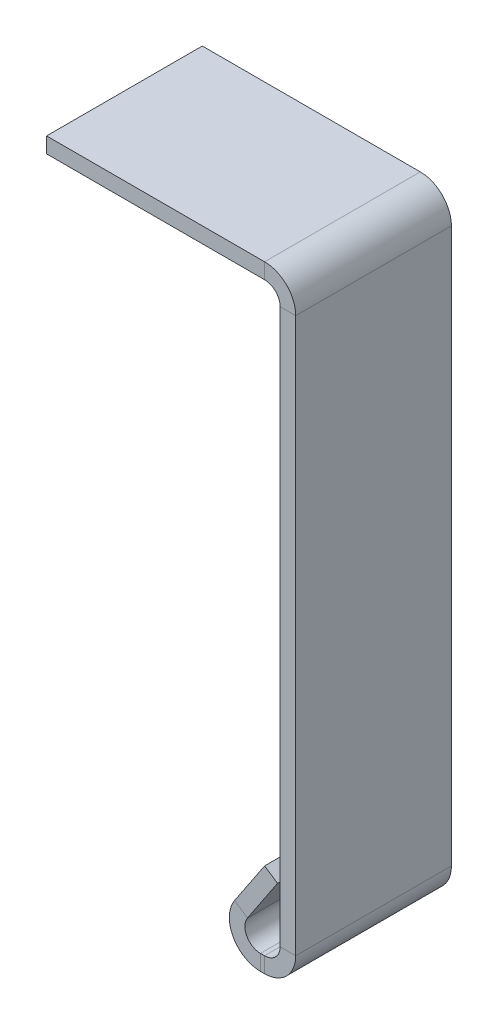
ISO-10303-21;
HEADER;
FILE_DESCRIPTION(('STEP AP214'),'2;1');
FILE_NAME('part.step','',(''),(''),'','','');
FILE_SCHEMA(('AUTOMOTIVE_DESIGN { 1 0 10303 214 1 1 1 1 }'));
ENDSEC;
DATA;
#1=APPLICATION_CONTEXT('core data for automotive mechanical design processes');
#2=APPLICATION_PROTOCOL_DEFINITION('international standard','automotive_design',2000,#1);
#3=PRODUCT_CONTEXT('',#1,'mechanical');
#4=PRODUCT('Part','Part','',(#3));
#5=PRODUCT_RELATED_PRODUCT_CATEGORY('part','',(#4));
#6=PRODUCT_DEFINITION_FORMATION('','',#4);
#7=PRODUCT_DEFINITION_CONTEXT('part definition',#1,'design');
#8=PRODUCT_DEFINITION('design','',#6,#7);
#9=PRODUCT_DEFINITION_SHAPE('','',#8);
#10=(LENGTH_UNIT() NAMED_UNIT(*) SI_UNIT(.MILLI.,.METRE.));
#11=(NAMED_UNIT(*) PLANE_ANGLE_UNIT() SI_UNIT($,.RADIAN.));
#12=(NAMED_UNIT(*) SI_UNIT($,.STERADIAN.) SOLID_ANGLE_UNIT());
#13=UNCERTAINTY_MEASURE_WITH_UNIT(LENGTH_MEASURE(1.E-05),#10,'distance_accuracy_value','');
#14=(GEOMETRIC_REPRESENTATION_CONTEXT(3) GLOBAL_UNCERTAINTY_ASSIGNED_CONTEXT((#13)) GLOBAL_UNIT_ASSIGNED_CONTEXT((#10,
#11,#12)) REPRESENTATION_CONTEXT('',''));
#15=CARTESIAN_POINT('',(0.,0.,0.));
#16=DIRECTION('',(0.,0.,1.));
#17=DIRECTION('',(1.,0.,0.));
#18=AXIS2_PLACEMENT_3D('',#15,#16,#17);
#19=CARTESIAN_POINT('',(0.,18.8,2.5));
#20=DIRECTION('',(0.,0.,1.));
#21=DIRECTION('',(1.,0.,0.));
#22=AXIS2_PLACEMENT_3D('',#19,#20,#21);
#23=PLANE('',#22);
#24=DIRECTION('',(-1.,0.,0.));
#25=VECTOR('',#24,1.);
#26=CARTESIAN_POINT('',(0.,18.8,2.5));
#27=LINE('',#26,#25);
#28=CARTESIAN_POINT('',(0.,18.8,2.5));
#29=VERTEX_POINT('',#28);
#30=CARTESIAN_POINT('',(-0.5,18.8,2.5));
#31=VERTEX_POINT('',#30);
#32=EDGE_CURVE('E11',#29,#31,#27,.T.);
#33=ORIENTED_EDGE('',*,*,#32,.F.);
#34=CARTESIAN_POINT('',(-1.,18.8,2.5));
#35=DIRECTION('',(0.,0.,1.));
#36=DIRECTION('',(1.,0.,0.));
#37=AXIS2_PLACEMENT_3D('',#34,#35,#36);
#38=CIRCLE('',#37,1.);
#39=CARTESIAN_POINT('',(-1.,19.8,2.5));
#40=VERTEX_POINT('',#39);
#41=EDGE_CURVE('E310',#40,#29,#38,.F.);
#42=ORIENTED_EDGE('',*,*,#41,.F.);
#43=DIRECTION('',(0.,1.,0.));
#44=VECTOR('',#43,1.);
#45=CARTESIAN_POINT('',(-1.,19.3,2.5));
#46=LINE('',#45,#44);
#47=CARTESIAN_POINT('',(-1.,19.3,2.5));
#48=VERTEX_POINT('',#47);
#49=EDGE_CURVE('E45',#48,#40,#46,.T.);
#50=ORIENTED_EDGE('',*,*,#49,.F.);
#51=CARTESIAN_POINT('',(-1.,18.8,2.5));
#52=DIRECTION('',(0.,0.,1.));
#53=DIRECTION('',(1.,0.,0.));
#54=AXIS2_PLACEMENT_3D('',#51,#52,#53);
#55=CIRCLE('',#54,0.5);
#56=EDGE_CURVE('E323',#48,#31,#55,.F.);
#57=ORIENTED_EDGE('',*,*,#56,.T.);
#58=EDGE_LOOP('',(#33,#42,#50,#57));
#59=FACE_BOUND('',#58,.T.);
#60=ADVANCED_FACE('F37',(#59),#23,.T.);
#61=CARTESIAN_POINT('',(-1.,19.3,2.5));
#62=DIRECTION('',(0.,0.,1.));
#63=DIRECTION('',(1.,0.,0.));
#64=AXIS2_PLACEMENT_3D('',#61,#62,#63);
#65=PLANE('',#64);
#66=DIRECTION('',(0.,-1.,0.));
#67=VECTOR('',#66,1.);
#68=CARTESIAN_POINT('',(0.,19.8,2.5));
#69=LINE('',#68,#67);
#70=CARTESIAN_POINT('',(0.,1.00000000000002,2.5));
#71=VERTEX_POINT('',#70);
#72=EDGE_CURVE('E314',#29,#71,#69,.T.);
#73=ORIENTED_EDGE('',*,*,#72,.F.);
#74=ORIENTED_EDGE('',*,*,#32,.T.);
#75=DIRECTION('',(0.,-1.,0.));
#76=VECTOR('',#75,1.);
#77=CARTESIAN_POINT('',(-0.5,19.8,2.5));
#78=LINE('',#77,#76);
#79=CARTESIAN_POINT('',(-0.5,1.00000000000001,2.5));
#80=VERTEX_POINT('',#79);
#81=EDGE_CURVE('E180',#31,#80,#78,.T.);
#82=ORIENTED_EDGE('',*,*,#81,.T.);
#83=DIRECTION('',(1.,0.,0.));
#84=VECTOR('',#83,1.);
#85=CARTESIAN_POINT('',(-0.5,1.00000000000001,2.5));
#86=LINE('',#85,#84);
#87=EDGE_CURVE('E171',#80,#71,#86,.T.);
#88=ORIENTED_EDGE('',*,*,#87,.T.);
#89=EDGE_LOOP('',(#73,#74,#82,#88));
#90=FACE_BOUND('',#89,.T.);
#91=ADVANCED_FACE('F328',(#90),#65,.T.);
#92=CARTESIAN_POINT('',(-1.,19.8,-2.5));
#93=DIRECTION('',(0.,0.,-1.));
#94=DIRECTION('',(-1.,0.,0.));
#95=AXIS2_PLACEMENT_3D('',#92,#93,#94);
#96=PLANE('',#95);
#97=DIRECTION('',(0.,-1.,0.));
#98=VECTOR('',#97,1.);
#99=CARTESIAN_POINT('',(-1.,19.8,-2.5));
#100=LINE('',#99,#98);
#101=CARTESIAN_POINT('',(-1.,19.8,-2.5));
#102=VERTEX_POINT('',#101);
#103=CARTESIAN_POINT('',(-1.,19.3,-2.5));
#104=VERTEX_POINT('',#103);
#105=EDGE_CURVE('E290',#102,#104,#100,.T.);
#106=ORIENTED_EDGE('',*,*,#105,.F.);
#107=CARTESIAN_POINT('',(-1.,18.8,-2.5));
#108=DIRECTION('',(0.,0.,1.));
#109=DIRECTION('',(1.,0.,0.));
#110=AXIS2_PLACEMENT_3D('',#107,#108,#109);
#111=CIRCLE('',#110,1.);
#112=CARTESIAN_POINT('',(0.,18.8,-2.5));
#113=VERTEX_POINT('',#112);
#114=EDGE_CURVE('E220',#102,#113,#111,.F.);
#115=ORIENTED_EDGE('',*,*,#114,.T.);
#116=DIRECTION('',(1.,0.,0.));
#117=VECTOR('',#116,1.);
#118=CARTESIAN_POINT('',(-0.5,18.8,-2.5));
#119=LINE('',#118,#117);
#120=CARTESIAN_POINT('',(-0.5,18.8,-2.5));
#121=VERTEX_POINT('',#120);
#122=EDGE_CURVE('E170',#121,#113,#119,.T.);
#123=ORIENTED_EDGE('',*,*,#122,.F.);
#124=CARTESIAN_POINT('',(-1.,18.8,-2.5));
#125=DIRECTION('',(0.,0.,1.));
#126=DIRECTION('',(1.,0.,0.));
#127=AXIS2_PLACEMENT_3D('',#124,#125,#126);
#128=CIRCLE('',#127,0.5);
#129=EDGE_CURVE('E232',#104,#121,#128,.F.);
#130=ORIENTED_EDGE('',*,*,#129,.F.);
#131=EDGE_LOOP('',(#106,#115,#123,#130));
#132=FACE_BOUND('',#131,.T.);
#133=ADVANCED_FACE('F380',(#132),#96,.T.);
#134=CARTESIAN_POINT('',(-0.5,18.8,-2.5));
#135=DIRECTION('',(0.,0.,-1.));
#136=DIRECTION('',(-1.,0.,0.));
#137=AXIS2_PLACEMENT_3D('',#134,#135,#136);
#138=PLANE('',#137);
#139=DIRECTION('',(1.,0.,0.));
#140=VECTOR('',#139,1.);
#141=CARTESIAN_POINT('',(-8.,19.8,-2.5));
#142=LINE('',#141,#140);
#143=CARTESIAN_POINT('',(-8.,19.8,-2.5));
#144=VERTEX_POINT('',#143);
#145=EDGE_CURVE('E223',#144,#102,#142,.T.);
#146=ORIENTED_EDGE('',*,*,#145,.T.);
#147=ORIENTED_EDGE('',*,*,#105,.T.);
#148=DIRECTION('',(1.,0.,0.));
#149=VECTOR('',#148,1.);
#150=CARTESIAN_POINT('',(-8.,19.3,-2.5));
#151=LINE('',#150,#149);
#152=CARTESIAN_POINT('',(-8.,19.3,-2.5));
#153=VERTEX_POINT('',#152);
#154=EDGE_CURVE('E229',#153,#104,#151,.T.);
#155=ORIENTED_EDGE('',*,*,#154,.F.);
#156=DIRECTION('',(0.,1.,0.));
#157=VECTOR('',#156,1.);
#158=CARTESIAN_POINT('',(-8.,19.3,-2.5));
#159=LINE('',#158,#157);
#160=EDGE_CURVE('E226',#153,#144,#159,.T.);
#161=ORIENTED_EDGE('',*,*,#160,.T.);
#162=EDGE_LOOP('',(#146,#147,#155,#161));
#163=FACE_BOUND('',#162,.T.);
#164=ADVANCED_FACE('F384',(#163),#138,.T.);
#165=CARTESIAN_POINT('',(-1.,0.,2.5));
#166=DIRECTION('',(0.,0.,1.));
#167=DIRECTION('',(1.,0.,0.));
#168=AXIS2_PLACEMENT_3D('',#165,#166,#167);
#169=PLANE('',#168);
#170=DIRECTION('',(0.,1.,0.));
#171=VECTOR('',#170,1.);
#172=CARTESIAN_POINT('',(-1.,0.,2.5));
#173=LINE('',#172,#171);
#174=CARTESIAN_POINT('',(-1.,0.,2.5));
#175=VERTEX_POINT('',#174);
#176=CARTESIAN_POINT('',(-1.,0.5,2.5));
#177=VERTEX_POINT('',#176);
#178=EDGE_CURVE('E158',#175,#177,#173,.T.);
#179=ORIENTED_EDGE('',*,*,#178,.F.);
#180=CARTESIAN_POINT('',(-1.,1.,2.5));
#181=DIRECTION('',(0.,0.,1.));
#182=DIRECTION('',(1.,0.,0.));
#183=AXIS2_PLACEMENT_3D('',#180,#181,#182);
#184=CIRCLE('',#183,1.);
#185=EDGE_CURVE('E340',#71,#175,#184,.F.);
#186=ORIENTED_EDGE('',*,*,#185,.F.);
#187=ORIENTED_EDGE('',*,*,#87,.F.);
#188=CARTESIAN_POINT('',(-1.,1.,2.5));
#189=DIRECTION('',(0.,0.,1.));
#190=DIRECTION('',(1.,0.,0.));
#191=AXIS2_PLACEMENT_3D('',#188,#189,#190);
#192=CIRCLE('',#191,0.5);
#193=EDGE_CURVE('E174',#80,#177,#192,.F.);
#194=ORIENTED_EDGE('',*,*,#193,.T.);
#195=EDGE_LOOP('',(#179,#186,#187,#194));
#196=FACE_BOUND('',#195,.T.);
#197=ADVANCED_FACE('F176',(#196),#169,.T.);
#198=CARTESIAN_POINT('',(-0.5,1.00000000000001,2.5));
#199=DIRECTION('',(0.,0.,1.));
#200=DIRECTION('',(1.,0.,0.));
#201=AXIS2_PLACEMENT_3D('',#198,#199,#200);
#202=PLANE('',#201);
#203=DIRECTION('',(-1.,0.,0.));
#204=VECTOR('',#203,1.);
#205=CARTESIAN_POINT('',(0.,0.,2.5));
#206=LINE('',#205,#204);
#207=CARTESIAN_POINT('',(-1.13148290817867,0.,2.5));
#208=VERTEX_POINT('',#207);
#209=EDGE_CURVE('E165',#175,#208,#206,.T.);
#210=ORIENTED_EDGE('',*,*,#209,.F.);
#211=ORIENTED_EDGE('',*,*,#178,.T.);
#212=DIRECTION('',(-1.,0.,0.));
#213=VECTOR('',#212,1.);
#214=CARTESIAN_POINT('',(0.,0.5,2.5));
#215=LINE('',#214,#213);
#216=CARTESIAN_POINT('',(-1.13148290817867,0.5,2.5));
#217=VERTEX_POINT('',#216);
#218=EDGE_CURVE('E162',#177,#217,#215,.T.);
#219=ORIENTED_EDGE('',*,*,#218,.T.);
#220=DIRECTION('',(0.,-1.,0.));
#221=VECTOR('',#220,1.);
#222=CARTESIAN_POINT('',(-1.13148290817867,0.5,2.5));
#223=LINE('',#222,#221);
#224=EDGE_CURVE('E281',#217,#208,#223,.T.);
#225=ORIENTED_EDGE('',*,*,#224,.T.);
#226=EDGE_LOOP('',(#210,#211,#219,#225));
#227=FACE_BOUND('',#226,.T.);
#228=ADVANCED_FACE('F160',(#227),#202,.T.);
#229=CARTESIAN_POINT('',(0.,1.00000000000002,-2.5));
#230=DIRECTION('',(0.,0.,-1.));
#231=DIRECTION('',(-1.,0.,0.));
#232=AXIS2_PLACEMENT_3D('',#229,#230,#231);
#233=PLANE('',#232);
#234=DIRECTION('',(-1.,0.,0.));
#235=VECTOR('',#234,1.);
#236=CARTESIAN_POINT('',(0.,1.00000000000002,-2.5));
#237=LINE('',#236,#235);
#238=CARTESIAN_POINT('',(0.,1.00000000000002,-2.5));
#239=VERTEX_POINT('',#238);
#240=CARTESIAN_POINT('',(-0.5,1.00000000000001,-2.5));
#241=VERTEX_POINT('',#240);
#242=EDGE_CURVE('E286',#239,#241,#237,.T.);
#243=ORIENTED_EDGE('',*,*,#242,.F.);
#244=CARTESIAN_POINT('',(-1.,1.,-2.5));
#245=DIRECTION('',(0.,0.,1.));
#246=DIRECTION('',(1.,0.,0.));
#247=AXIS2_PLACEMENT_3D('',#244,#245,#246);
#248=CIRCLE('',#247,1.);
#249=CARTESIAN_POINT('',(-1.,0.,-2.5));
#250=VERTEX_POINT('',#249);
#251=EDGE_CURVE('E214',#239,#250,#248,.F.);
#252=ORIENTED_EDGE('',*,*,#251,.T.);
#253=DIRECTION('',(0.,-1.,0.));
#254=VECTOR('',#253,1.);
#255=CARTESIAN_POINT('',(-1.,0.5,-2.5));
#256=LINE('',#255,#254);
#257=CARTESIAN_POINT('',(-1.,0.5,-2.5));
#258=VERTEX_POINT('',#257);
#259=EDGE_CURVE('E284',#258,#250,#256,.T.);
#260=ORIENTED_EDGE('',*,*,#259,.F.);
#261=CARTESIAN_POINT('',(-1.,1.,-2.5));
#262=DIRECTION('',(0.,0.,1.));
#263=DIRECTION('',(1.,0.,0.));
#264=AXIS2_PLACEMENT_3D('',#261,#262,#263);
#265=CIRCLE('',#264,0.5);
#266=EDGE_CURVE('E187',#241,#258,#265,.F.);
#267=ORIENTED_EDGE('',*,*,#266,.F.);
#268=EDGE_LOOP('',(#243,#252,#260,#267));
#269=FACE_BOUND('',#268,.T.);
#270=ADVANCED_FACE('F334',(#269),#233,.T.);
#271=CARTESIAN_POINT('',(-1.,0.5,-2.5));
#272=DIRECTION('',(0.,0.,-1.));
#273=DIRECTION('',(-1.,0.,0.));
#274=AXIS2_PLACEMENT_3D('',#271,#272,#273);
#275=PLANE('',#274);
#276=DIRECTION('',(0.,-1.,0.));
#277=VECTOR('',#276,1.);
#278=CARTESIAN_POINT('',(0.,19.8,-2.5));
#279=LINE('',#278,#277);
#280=EDGE_CURVE('E217',#113,#239,#279,.T.);
#281=ORIENTED_EDGE('',*,*,#280,.T.);
#282=ORIENTED_EDGE('',*,*,#242,.T.);
#283=DIRECTION('',(0.,-1.,0.));
#284=VECTOR('',#283,1.);
#285=CARTESIAN_POINT('',(-0.5,19.8,-2.5));
#286=LINE('',#285,#284);
#287=EDGE_CURVE('E235',#121,#241,#286,.T.);
#288=ORIENTED_EDGE('',*,*,#287,.F.);
#289=ORIENTED_EDGE('',*,*,#122,.T.);
#290=EDGE_LOOP('',(#281,#282,#288,#289));
#291=FACE_BOUND('',#290,.T.);
#292=ADVANCED_FACE('F392',(#291),#275,.T.);
#293=CARTESIAN_POINT('',(-1.96353320251651,1.55470019622523,2.5));
#294=DIRECTION('',(0.,0.,1.));
#295=DIRECTION('',(1.,0.,0.));
#296=AXIS2_PLACEMENT_3D('',#293,#294,#295);
#297=PLANE('',#296);
#298=DIRECTION('',(0.832050294337843,-0.554700196225229,0.));
#299=VECTOR('',#298,1.);
#300=CARTESIAN_POINT('',(-1.96353320251651,1.55470019622523,2.5));
#301=LINE('',#300,#299);
#302=CARTESIAN_POINT('',(-1.96353320251651,1.55470019622523,2.5));
#303=VERTEX_POINT('',#302);
#304=CARTESIAN_POINT('',(-1.54750805534759,1.27735009811261,2.5));
#305=VERTEX_POINT('',#304);
#306=EDGE_CURVE('E53',#303,#305,#301,.T.);
#307=ORIENTED_EDGE('',*,*,#306,.F.);
#308=CARTESIAN_POINT('',(-1.13148290817867,1.,2.5));
#309=DIRECTION('',(0.,0.,1.));
#310=DIRECTION('',(1.,0.,0.));
#311=AXIS2_PLACEMENT_3D('',#308,#309,#310);
#312=CIRCLE('',#311,1.);
#313=EDGE_CURVE('E368',#208,#303,#312,.F.);
#314=ORIENTED_EDGE('',*,*,#313,.F.);
#315=ORIENTED_EDGE('',*,*,#224,.F.);
#316=CARTESIAN_POINT('',(-1.13148290817867,1.,2.5));
#317=DIRECTION('',(0.,0.,1.));
#318=DIRECTION('',(1.,0.,0.));
#319=AXIS2_PLACEMENT_3D('',#316,#317,#318);
#320=CIRCLE('',#319,0.5);
#321=EDGE_CURVE('E195',#217,#305,#320,.F.);
#322=ORIENTED_EDGE('',*,*,#321,.T.);
#323=EDGE_LOOP('',(#307,#314,#315,#322));
#324=FACE_BOUND('',#323,.T.);
#325=ADVANCED_FACE('F394',(#324),#297,.T.);
#326=CARTESIAN_POINT('',(-1.13148290817867,0.5,2.5));
#327=DIRECTION('',(0.,0.,1.));
#328=DIRECTION('',(1.,0.,0.));
#329=AXIS2_PLACEMENT_3D('',#326,#327,#328);
#330=PLANE('',#329);
#331=DIRECTION('',(0.554700196225229,0.832050294337843,0.));
#332=VECTOR('',#331,1.);
#333=CARTESIAN_POINT('',(-3.,0.,2.5));
#334=LINE('',#333,#332);
#335=CARTESIAN_POINT('',(-0.999999999999998,3.,2.5));
#336=VERTEX_POINT('',#335);
#337=EDGE_CURVE('E366',#303,#336,#334,.T.);
#338=ORIENTED_EDGE('',*,*,#337,.F.);
#339=ORIENTED_EDGE('',*,*,#306,.T.);
#340=DIRECTION('',(0.554700196225229,0.832050294337843,0.));
#341=VECTOR('',#340,1.);
#342=CARTESIAN_POINT('',(-2.58397485283108,-0.277350098112615,2.5));
#343=LINE('',#342,#341);
#344=CARTESIAN_POINT('',(-0.583974852831077,2.72264990188738,2.5));
#345=VERTEX_POINT('',#344);
#346=EDGE_CURVE('E119',#305,#345,#343,.T.);
#347=ORIENTED_EDGE('',*,*,#346,.T.);
#348=DIRECTION('',(0.832050294337843,-0.55470019622523,0.));
#349=VECTOR('',#348,1.);
#350=CARTESIAN_POINT('',(-0.999999999999998,3.,2.5));
#351=LINE('',#350,#349);
#352=EDGE_CURVE('E364',#336,#345,#351,.T.);
#353=ORIENTED_EDGE('',*,*,#352,.F.);
#354=EDGE_LOOP('',(#338,#339,#347,#353));
#355=FACE_BOUND('',#354,.T.);
#356=ADVANCED_FACE('F400',(#355),#330,.T.);
#357=CARTESIAN_POINT('',(-1.13148290817867,0.,-2.5));
#358=DIRECTION('',(0.,0.,-1.));
#359=DIRECTION('',(-1.,0.,0.));
#360=AXIS2_PLACEMENT_3D('',#357,#358,#359);
#361=PLANE('',#360);
#362=DIRECTION('',(0.,1.,0.));
#363=VECTOR('',#362,1.);
#364=CARTESIAN_POINT('',(-1.13148290817867,0.,-2.5));
#365=LINE('',#364,#363);
#366=CARTESIAN_POINT('',(-1.13148290817867,0.,-2.5));
#367=VERTEX_POINT('',#366);
#368=CARTESIAN_POINT('',(-1.13148290817867,0.5,-2.5));
#369=VERTEX_POINT('',#368);
#370=EDGE_CURVE('E106',#367,#369,#365,.T.);
#371=ORIENTED_EDGE('',*,*,#370,.F.);
#372=CARTESIAN_POINT('',(-1.13148290817867,1.,-2.5));
#373=DIRECTION('',(0.,0.,1.));
#374=DIRECTION('',(1.,0.,0.));
#375=AXIS2_PLACEMENT_3D('',#372,#373,#374);
#376=CIRCLE('',#375,1.);
#377=CARTESIAN_POINT('',(-1.96353320251651,1.55470019622523,-2.5));
#378=VERTEX_POINT('',#377);
#379=EDGE_CURVE('E210',#367,#378,#376,.F.);
#380=ORIENTED_EDGE('',*,*,#379,.T.);
#381=DIRECTION('',(-0.832050294337843,0.554700196225229,0.));
#382=VECTOR('',#381,1.);
#383=CARTESIAN_POINT('',(-1.54750805534759,1.27735009811261,-2.5));
#384=LINE('',#383,#382);
#385=CARTESIAN_POINT('',(-1.54750805534759,1.27735009811261,-2.5));
#386=VERTEX_POINT('',#385);
#387=EDGE_CURVE('E113',#386,#378,#384,.T.);
#388=ORIENTED_EDGE('',*,*,#387,.F.);
#389=CARTESIAN_POINT('',(-1.13148290817867,1.,-2.5));
#390=DIRECTION('',(0.,0.,1.));
#391=DIRECTION('',(1.,0.,0.));
#392=AXIS2_PLACEMENT_3D('',#389,#390,#391);
#393=CIRCLE('',#392,0.5);
#394=EDGE_CURVE('E241',#369,#386,#393,.F.);
#395=ORIENTED_EDGE('',*,*,#394,.F.);
#396=EDGE_LOOP('',(#371,#380,#388,#395));
#397=FACE_BOUND('',#396,.T.);
#398=ADVANCED_FACE('F351',(#397),#361,.T.);
#399=CARTESIAN_POINT('',(-1.54750805534759,1.27735009811261,-2.5));
#400=DIRECTION('',(0.,0.,-1.));
#401=DIRECTION('',(-1.,0.,0.));
#402=AXIS2_PLACEMENT_3D('',#399,#400,#401);
#403=PLANE('',#402);
#404=DIRECTION('',(-1.,0.,0.));
#405=VECTOR('',#404,1.);
#406=CARTESIAN_POINT('',(0.,0.,-2.5));
#407=LINE('',#406,#405);
#408=EDGE_CURVE('E212',#250,#367,#407,.T.);
#409=ORIENTED_EDGE('',*,*,#408,.T.);
#410=ORIENTED_EDGE('',*,*,#370,.T.);
#411=DIRECTION('',(-1.,0.,0.));
#412=VECTOR('',#411,1.);
#413=CARTESIAN_POINT('',(0.,0.5,-2.5));
#414=LINE('',#413,#412);
#415=EDGE_CURVE('E239',#258,#369,#414,.T.);
#416=ORIENTED_EDGE('',*,*,#415,.F.);
#417=ORIENTED_EDGE('',*,*,#259,.T.);
#418=EDGE_LOOP('',(#409,#410,#416,#417));
#419=FACE_BOUND('',#418,.T.);
#420=ADVANCED_FACE('F336',(#419),#403,.T.);
#421=CARTESIAN_POINT('',(-2.58397485283108,-0.277350098112615,2.5));
#422=DIRECTION('',(-0.832050294337843,0.554700196225229,0.));
#423=DIRECTION('',(-0.554700196225229,-0.832050294337843,0.));
#424=AXIS2_PLACEMENT_3D('',#421,#422,#423);
#425=PLANE('',#424);
#426=DIRECTION('',(0.554700196225229,0.832050294337843,0.));
#427=VECTOR('',#426,1.);
#428=CARTESIAN_POINT('',(-2.58397485283108,-0.277350098112615,-2.5));
#429=LINE('',#428,#427);
#430=CARTESIAN_POINT('',(-0.583974852831077,2.72264990188738,-2.5));
#431=VERTEX_POINT('',#430);
#432=EDGE_CURVE('E201',#386,#431,#429,.T.);
#433=ORIENTED_EDGE('',*,*,#432,.T.);
#434=DIRECTION('',(0.,0.,-1.));
#435=VECTOR('',#434,1.);
#436=CARTESIAN_POINT('',(-0.583974852831077,2.72264990188738,2.5));
#437=LINE('',#436,#435);
#438=EDGE_CURVE('E277',#345,#431,#437,.T.);
#439=ORIENTED_EDGE('',*,*,#438,.F.);
#440=ORIENTED_EDGE('',*,*,#346,.F.);
#441=DIRECTION('',(0.,0.,-1.));
#442=VECTOR('',#441,1.);
#443=CARTESIAN_POINT('',(-1.54750805534759,1.27735009811261,2.5));
#444=LINE('',#443,#442);
#445=EDGE_CURVE('E197',#305,#386,#444,.T.);
#446=ORIENTED_EDGE('',*,*,#445,.T.);
#447=EDGE_LOOP('',(#433,#439,#440,#446));
#448=FACE_BOUND('',#447,.T.);
#449=ADVANCED_FACE('F357',(#448),#425,.F.);
#450=CARTESIAN_POINT('',(-0.999999999999998,3.,2.5));
#451=DIRECTION('',(0.55470019622523,0.832050294337843,0.));
#452=DIRECTION('',(-0.832050294337843,0.55470019622523,0.));
#453=AXIS2_PLACEMENT_3D('',#450,#451,#452);
#454=PLANE('',#453);
#455=DIRECTION('',(0.832050294337843,-0.55470019622523,0.));
#456=VECTOR('',#455,1.);
#457=CARTESIAN_POINT('',(-0.999999999999998,3.,-2.5));
#458=LINE('',#457,#456);
#459=CARTESIAN_POINT('',(-0.999999999999998,3.,-2.5));
#460=VERTEX_POINT('',#459);
#461=EDGE_CURVE('E204',#460,#431,#458,.T.);
#462=ORIENTED_EDGE('',*,*,#461,.F.);
#463=DIRECTION('',(0.,0.,-1.));
#464=VECTOR('',#463,1.);
#465=CARTESIAN_POINT('',(-0.999999999999998,3.,2.5));
#466=LINE('',#465,#464);
#467=EDGE_CURVE('E275',#336,#460,#466,.T.);
#468=ORIENTED_EDGE('',*,*,#467,.F.);
#469=ORIENTED_EDGE('',*,*,#352,.T.);
#470=ORIENTED_EDGE('',*,*,#438,.T.);
#471=EDGE_LOOP('',(#462,#468,#469,#470));
#472=FACE_BOUND('',#471,.T.);
#473=ADVANCED_FACE('F362',(#472),#454,.T.);
#474=CARTESIAN_POINT('',(-3.,0.,2.5));
#475=DIRECTION('',(-0.832050294337843,0.554700196225229,0.));
#476=DIRECTION('',(-0.554700196225229,-0.832050294337843,0.));
#477=AXIS2_PLACEMENT_3D('',#474,#475,#476);
#478=PLANE('',#477);
#479=DIRECTION('',(0.554700196225229,0.832050294337843,0.));
#480=VECTOR('',#479,1.);
#481=CARTESIAN_POINT('',(-3.,0.,-2.5));
#482=LINE('',#481,#480);
#483=EDGE_CURVE('E207',#378,#460,#482,.T.);
#484=ORIENTED_EDGE('',*,*,#483,.F.);
#485=DIRECTION('',(0.,0.,-1.));
#486=VECTOR('',#485,1.);
#487=CARTESIAN_POINT('',(-1.96353320251651,1.55470019622523,2.5));
#488=LINE('',#487,#486);
#489=EDGE_CURVE('E272',#303,#378,#488,.T.);
#490=ORIENTED_EDGE('',*,*,#489,.F.);
#491=ORIENTED_EDGE('',*,*,#337,.T.);
#492=ORIENTED_EDGE('',*,*,#467,.T.);
#493=EDGE_LOOP('',(#484,#490,#491,#492));
#494=FACE_BOUND('',#493,.T.);
#495=ADVANCED_FACE('F484',(#494),#478,.T.);
#496=CARTESIAN_POINT('',(-1.13148290817867,1.,2.5));
#497=DIRECTION('',(0.,0.,-1.));
#498=DIRECTION('',(-1.,0.,0.));
#499=AXIS2_PLACEMENT_3D('',#496,#497,#498);
#500=CYLINDRICAL_SURFACE('',#499,1.);
#501=ORIENTED_EDGE('',*,*,#379,.F.);
#502=DIRECTION('',(0.,0.,-1.));
#503=VECTOR('',#502,1.);
#504=CARTESIAN_POINT('',(-1.13148290817867,0.,2.5));
#505=LINE('',#504,#503);
#506=EDGE_CURVE('E269',#208,#367,#505,.T.);
#507=ORIENTED_EDGE('',*,*,#506,.F.);
#508=ORIENTED_EDGE('',*,*,#313,.T.);
#509=ORIENTED_EDGE('',*,*,#489,.T.);
#510=EDGE_LOOP('',(#501,#507,#508,#509));
#511=FACE_BOUND('',#510,.T.);
#512=ADVANCED_FACE('F348',(#511),#500,.T.);
#513=CARTESIAN_POINT('',(0.,0.,2.5));
#514=DIRECTION('',(0.,-1.,0.));
#515=DIRECTION('',(1.,0.,0.));
#516=AXIS2_PLACEMENT_3D('',#513,#514,#515);
#517=PLANE('',#516);
#518=ORIENTED_EDGE('',*,*,#408,.F.);
#519=DIRECTION('',(0.,0.,-1.));
#520=VECTOR('',#519,1.);
#521=CARTESIAN_POINT('',(-1.,0.,2.5));
#522=LINE('',#521,#520);
#523=EDGE_CURVE('E266',#175,#250,#522,.T.);
#524=ORIENTED_EDGE('',*,*,#523,.F.);
#525=ORIENTED_EDGE('',*,*,#209,.T.);
#526=ORIENTED_EDGE('',*,*,#506,.T.);
#527=EDGE_LOOP('',(#518,#524,#525,#526));
#528=FACE_BOUND('',#527,.T.);
#529=ADVANCED_FACE('F342',(#528),#517,.T.);
#530=CARTESIAN_POINT('',(-1.,1.,2.5));
#531=DIRECTION('',(0.,0.,-1.));
#532=DIRECTION('',(-1.,0.,0.));
#533=AXIS2_PLACEMENT_3D('',#530,#531,#532);
#534=CYLINDRICAL_SURFACE('',#533,1.);
#535=ORIENTED_EDGE('',*,*,#251,.F.);
#536=DIRECTION('',(0.,0.,-1.));
#537=VECTOR('',#536,1.);
#538=CARTESIAN_POINT('',(0.,1.00000000000002,2.5));
#539=LINE('',#538,#537);
#540=EDGE_CURVE('E263',#71,#239,#539,.T.);
#541=ORIENTED_EDGE('',*,*,#540,.F.);
#542=ORIENTED_EDGE('',*,*,#185,.T.);
#543=ORIENTED_EDGE('',*,*,#523,.T.);
#544=EDGE_LOOP('',(#535,#541,#542,#543));
#545=FACE_BOUND('',#544,.T.);
#546=ADVANCED_FACE('F339',(#545),#534,.T.);
#547=CARTESIAN_POINT('',(0.,19.8,2.5));
#548=DIRECTION('',(1.,0.,0.));
#549=DIRECTION('',(0.,1.,0.));
#550=AXIS2_PLACEMENT_3D('',#547,#548,#549);
#551=PLANE('',#550);
#552=ORIENTED_EDGE('',*,*,#280,.F.);
#553=DIRECTION('',(0.,0.,-1.));
#554=VECTOR('',#553,1.);
#555=CARTESIAN_POINT('',(0.,18.8,2.5));
#556=LINE('',#555,#554);
#557=EDGE_CURVE('E260',#29,#113,#556,.T.);
#558=ORIENTED_EDGE('',*,*,#557,.F.);
#559=ORIENTED_EDGE('',*,*,#72,.T.);
#560=ORIENTED_EDGE('',*,*,#540,.T.);
#561=EDGE_LOOP('',(#552,#558,#559,#560));
#562=FACE_BOUND('',#561,.T.);
#563=ADVANCED_FACE('F377',(#562),#551,.T.);
#564=CARTESIAN_POINT('',(-1.,18.8,2.5));
#565=DIRECTION('',(0.,0.,-1.));
#566=DIRECTION('',(-1.,0.,0.));
#567=AXIS2_PLACEMENT_3D('',#564,#565,#566);
#568=CYLINDRICAL_SURFACE('',#567,1.);
#569=ORIENTED_EDGE('',*,*,#114,.F.);
#570=DIRECTION('',(0.,0.,-1.));
#571=VECTOR('',#570,1.);
#572=CARTESIAN_POINT('',(-1.,19.8,2.5));
#573=LINE('',#572,#571);
#574=EDGE_CURVE('E257',#40,#102,#573,.T.);
#575=ORIENTED_EDGE('',*,*,#574,.F.);
#576=ORIENTED_EDGE('',*,*,#41,.T.);
#577=ORIENTED_EDGE('',*,*,#557,.T.);
#578=EDGE_LOOP('',(#569,#575,#576,#577));
#579=FACE_BOUND('',#578,.T.);
#580=ADVANCED_FACE('F309',(#579),#568,.T.);
#581=CARTESIAN_POINT('',(-8.,19.8,2.5));
#582=DIRECTION('',(0.,1.,0.));
#583=DIRECTION('',(0.,0.,1.));
#584=AXIS2_PLACEMENT_3D('',#581,#582,#583);
#585=PLANE('',#584);
#586=ORIENTED_EDGE('',*,*,#145,.F.);
#587=DIRECTION('',(0.,0.,-1.));
#588=VECTOR('',#587,1.);
#589=CARTESIAN_POINT('',(-8.,19.8,2.5));
#590=LINE('',#589,#588);
#591=CARTESIAN_POINT('',(-8.,19.8,2.5));
#592=VERTEX_POINT('',#591);
#593=EDGE_CURVE('E255',#592,#144,#590,.T.);
#594=ORIENTED_EDGE('',*,*,#593,.F.);
#595=DIRECTION('',(1.,0.,0.));
#596=VECTOR('',#595,1.);
#597=CARTESIAN_POINT('',(-8.,19.8,2.5));
#598=LINE('',#597,#596);
#599=EDGE_CURVE('E298',#592,#40,#598,.T.);
#600=ORIENTED_EDGE('',*,*,#599,.T.);
#601=ORIENTED_EDGE('',*,*,#574,.T.);
#602=EDGE_LOOP('',(#586,#594,#600,#601));
#603=FACE_BOUND('',#602,.T.);
#604=ADVANCED_FACE('F316',(#603),#585,.T.);
#605=CARTESIAN_POINT('',(-8.,19.3,2.5));
#606=DIRECTION('',(-1.,0.,0.));
#607=DIRECTION('',(0.,0.,1.));
#608=AXIS2_PLACEMENT_3D('',#605,#606,#607);
#609=PLANE('',#608);
#610=ORIENTED_EDGE('',*,*,#160,.F.);
#611=DIRECTION('',(0.,0.,-1.));
#612=VECTOR('',#611,1.);
#613=CARTESIAN_POINT('',(-8.,19.3,2.5));
#614=LINE('',#613,#612);
#615=CARTESIAN_POINT('',(-8.,19.3,2.5));
#616=VERTEX_POINT('',#615);
#617=EDGE_CURVE('E253',#616,#153,#614,.T.);
#618=ORIENTED_EDGE('',*,*,#617,.F.);
#619=DIRECTION('',(0.,1.,0.));
#620=VECTOR('',#619,1.);
#621=CARTESIAN_POINT('',(-8.,19.3,2.5));
#622=LINE('',#621,#620);
#623=EDGE_CURVE('E317',#616,#592,#622,.T.);
#624=ORIENTED_EDGE('',*,*,#623,.T.);
#625=ORIENTED_EDGE('',*,*,#593,.T.);
#626=EDGE_LOOP('',(#610,#618,#624,#625));
#627=FACE_BOUND('',#626,.T.);
#628=ADVANCED_FACE('F549',(#627),#609,.T.);
#629=CARTESIAN_POINT('',(-8.,19.3,2.5));
#630=DIRECTION('',(0.,1.,0.));
#631=DIRECTION('',(0.,0.,1.));
#632=AXIS2_PLACEMENT_3D('',#629,#630,#631);
#633=PLANE('',#632);
#634=ORIENTED_EDGE('',*,*,#154,.T.);
#635=DIRECTION('',(0.,0.,-1.));
#636=VECTOR('',#635,1.);
#637=CARTESIAN_POINT('',(-1.,19.3,2.5));
#638=LINE('',#637,#636);
#639=EDGE_CURVE('E250',#48,#104,#638,.T.);
#640=ORIENTED_EDGE('',*,*,#639,.F.);
#641=DIRECTION('',(1.,0.,0.));
#642=VECTOR('',#641,1.);
#643=CARTESIAN_POINT('',(-8.,19.3,2.5));
#644=LINE('',#643,#642);
#645=EDGE_CURVE('E301',#616,#48,#644,.T.);
#646=ORIENTED_EDGE('',*,*,#645,.F.);
#647=ORIENTED_EDGE('',*,*,#617,.T.);
#648=EDGE_LOOP('',(#634,#640,#646,#647));
#649=FACE_BOUND('',#648,.T.);
#650=ADVANCED_FACE('F387',(#649),#633,.F.);
#651=CARTESIAN_POINT('',(-1.,18.8,2.5));
#652=DIRECTION('',(0.,0.,-1.));
#653=DIRECTION('',(-1.,0.,0.));
#654=AXIS2_PLACEMENT_3D('',#651,#652,#653);
#655=CYLINDRICAL_SURFACE('',#654,0.5);
#656=ORIENTED_EDGE('',*,*,#129,.T.);
#657=DIRECTION('',(0.,0.,-1.));
#658=VECTOR('',#657,1.);
#659=CARTESIAN_POINT('',(-0.5,18.8,2.5));
#660=LINE('',#659,#658);
#661=EDGE_CURVE('E247',#31,#121,#660,.T.);
#662=ORIENTED_EDGE('',*,*,#661,.F.);
#663=ORIENTED_EDGE('',*,*,#56,.F.);
#664=ORIENTED_EDGE('',*,*,#639,.T.);
#665=EDGE_LOOP('',(#656,#662,#663,#664));
#666=FACE_BOUND('',#665,.T.);
#667=ADVANCED_FACE('F390',(#666),#655,.F.);
#668=CARTESIAN_POINT('',(-0.5,19.8,2.5));
#669=DIRECTION('',(1.,0.,0.));
#670=DIRECTION('',(0.,1.,0.));
#671=AXIS2_PLACEMENT_3D('',#668,#669,#670);
#672=PLANE('',#671);
#673=ORIENTED_EDGE('',*,*,#287,.T.);
#674=DIRECTION('',(0.,0.,-1.));
#675=VECTOR('',#674,1.);
#676=CARTESIAN_POINT('',(-0.5,1.00000000000001,2.5));
#677=LINE('',#676,#675);
#678=EDGE_CURVE('E189',#80,#241,#677,.T.);
#679=ORIENTED_EDGE('',*,*,#678,.F.);
#680=ORIENTED_EDGE('',*,*,#81,.F.);
#681=ORIENTED_EDGE('',*,*,#661,.T.);
#682=EDGE_LOOP('',(#673,#679,#680,#681));
#683=FACE_BOUND('',#682,.T.);
#684=ADVANCED_FACE('F331',(#683),#672,.F.);
#685=CARTESIAN_POINT('',(-1.,1.,2.5));
#686=DIRECTION('',(0.,0.,-1.));
#687=DIRECTION('',(-1.,0.,0.));
#688=AXIS2_PLACEMENT_3D('',#685,#686,#687);
#689=CYLINDRICAL_SURFACE('',#688,0.5);
#690=ORIENTED_EDGE('',*,*,#266,.T.);
#691=DIRECTION('',(0.,0.,-1.));
#692=VECTOR('',#691,1.);
#693=CARTESIAN_POINT('',(-1.,0.5,2.5));
#694=LINE('',#693,#692);
#695=EDGE_CURVE('E184',#177,#258,#694,.T.);
#696=ORIENTED_EDGE('',*,*,#695,.F.);
#697=ORIENTED_EDGE('',*,*,#193,.F.);
#698=ORIENTED_EDGE('',*,*,#678,.T.);
#699=EDGE_LOOP('',(#690,#696,#697,#698));
#700=FACE_BOUND('',#699,.T.);
#701=ADVANCED_FACE('F185',(#700),#689,.F.);
#702=CARTESIAN_POINT('',(0.,0.5,2.5));
#703=DIRECTION('',(0.,-1.,0.));
#704=DIRECTION('',(1.,0.,0.));
#705=AXIS2_PLACEMENT_3D('',#702,#703,#704);
#706=PLANE('',#705);
#707=ORIENTED_EDGE('',*,*,#415,.T.);
#708=DIRECTION('',(0.,0.,-1.));
#709=VECTOR('',#708,1.);
#710=CARTESIAN_POINT('',(-1.13148290817867,0.5,2.5));
#711=LINE('',#710,#709);
#712=EDGE_CURVE('E190',#217,#369,#711,.T.);
#713=ORIENTED_EDGE('',*,*,#712,.F.);
#714=ORIENTED_EDGE('',*,*,#218,.F.);
#715=ORIENTED_EDGE('',*,*,#695,.T.);
#716=EDGE_LOOP('',(#707,#713,#714,#715));
#717=FACE_BOUND('',#716,.T.);
#718=ADVANCED_FACE('F192',(#717),#706,.F.);
#719=CARTESIAN_POINT('',(-1.13148290817867,1.,2.5));
#720=DIRECTION('',(0.,0.,-1.));
#721=DIRECTION('',(-1.,0.,0.));
#722=AXIS2_PLACEMENT_3D('',#719,#720,#721);
#723=CYLINDRICAL_SURFACE('',#722,0.5);
#724=ORIENTED_EDGE('',*,*,#394,.T.);
#725=ORIENTED_EDGE('',*,*,#445,.F.);
#726=ORIENTED_EDGE('',*,*,#321,.F.);
#727=ORIENTED_EDGE('',*,*,#712,.T.);
#728=EDGE_LOOP('',(#724,#725,#726,#727));
#729=FACE_BOUND('',#728,.T.);
#730=ADVANCED_FACE('F354',(#729),#723,.F.);
#731=CARTESIAN_POINT('',(-1.13148290817867,1.,2.5));
#732=DIRECTION('',(0.,0.,1.));
#733=DIRECTION('',(1.,0.,0.));
#734=AXIS2_PLACEMENT_3D('',#731,#732,#733);
#735=PLANE('',#734);
#736=ORIENTED_EDGE('',*,*,#645,.T.);
#737=ORIENTED_EDGE('',*,*,#49,.T.);
#738=ORIENTED_EDGE('',*,*,#599,.F.);
#739=ORIENTED_EDGE('',*,*,#623,.F.);
#740=EDGE_LOOP('',(#736,#737,#738,#739));
#741=FACE_BOUND('',#740,.T.);
#742=ADVANCED_FACE('F295',(#741),#735,.T.);
#743=CARTESIAN_POINT('',(-1.13148290817867,1.,-2.5));
#744=DIRECTION('',(0.,0.,1.));
#745=DIRECTION('',(1.,0.,0.));
#746=AXIS2_PLACEMENT_3D('',#743,#744,#745);
#747=PLANE('',#746);
#748=ORIENTED_EDGE('',*,*,#432,.F.);
#749=ORIENTED_EDGE('',*,*,#387,.T.);
#750=ORIENTED_EDGE('',*,*,#483,.T.);
#751=ORIENTED_EDGE('',*,*,#461,.T.);
#752=EDGE_LOOP('',(#748,#749,#750,#751));
#753=FACE_BOUND('',#752,.T.);
#754=ADVANCED_FACE('F359',(#753),#747,.F.);
#755=CLOSED_SHELL('',(#60,#91,#133,#164,#197,#228,#270,#292,#325,#356,#398,#420,#449,#473,#495,
#512,#529,#546,#563,#580,#604,#628,#650,#667,#684,#701,#718,#730,#742,#754));
#756=MANIFOLD_SOLID_BREP('B2',#755);
#757=ADVANCED_BREP_SHAPE_REPRESENTATION('',(#18,#756),#14);
#758=SHAPE_DEFINITION_REPRESENTATION(#9,#757);
ENDSEC;
END-ISO-10303-21;
